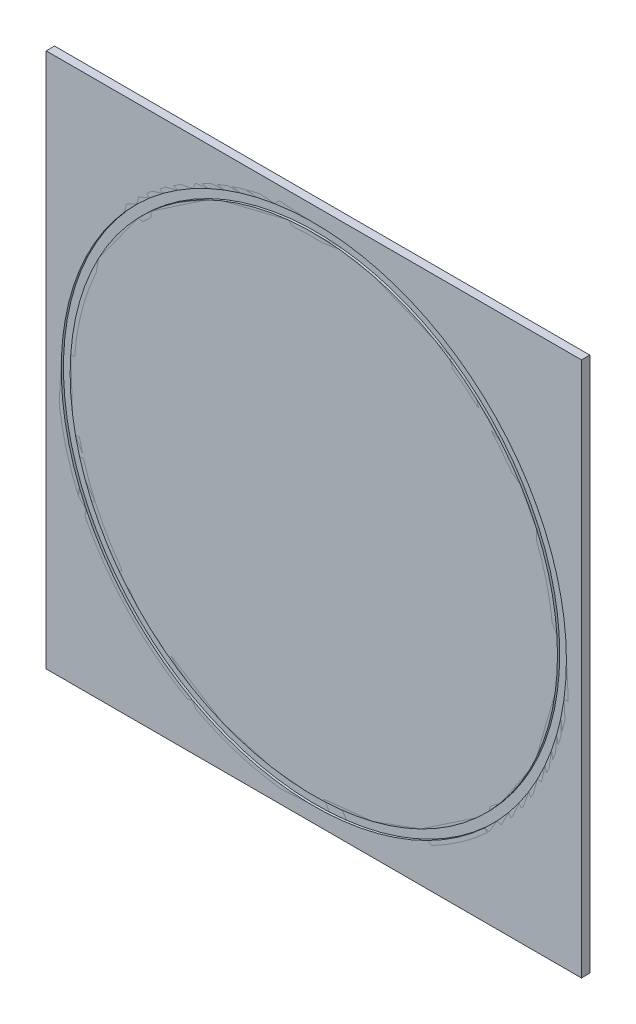
ISO-10303-21;
HEADER;
FILE_DESCRIPTION(('STEP AP214'),'2;1');
FILE_NAME('part.step','',(''),(''),'','','');
FILE_SCHEMA(('AUTOMOTIVE_DESIGN { 1 0 10303 214 1 1 1 1 }'));
ENDSEC;
DATA;
#1=APPLICATION_CONTEXT('core data for automotive mechanical design processes');
#2=APPLICATION_PROTOCOL_DEFINITION('international standard','automotive_design',2000,#1);
#3=PRODUCT_CONTEXT('',#1,'mechanical');
#4=PRODUCT('Part','Part','',(#3));
#5=PRODUCT_RELATED_PRODUCT_CATEGORY('part','',(#4));
#6=PRODUCT_DEFINITION_FORMATION('','',#4);
#7=PRODUCT_DEFINITION_CONTEXT('part definition',#1,'design');
#8=PRODUCT_DEFINITION('design','',#6,#7);
#9=PRODUCT_DEFINITION_SHAPE('','',#8);
#10=(LENGTH_UNIT() NAMED_UNIT(*) SI_UNIT(.MILLI.,.METRE.));
#11=(NAMED_UNIT(*) PLANE_ANGLE_UNIT() SI_UNIT($,.RADIAN.));
#12=(NAMED_UNIT(*) SI_UNIT($,.STERADIAN.) SOLID_ANGLE_UNIT());
#13=UNCERTAINTY_MEASURE_WITH_UNIT(LENGTH_MEASURE(1.E-05),#10,'distance_accuracy_value','');
#14=(GEOMETRIC_REPRESENTATION_CONTEXT(3) GLOBAL_UNCERTAINTY_ASSIGNED_CONTEXT((#13)) GLOBAL_UNIT_ASSIGNED_CONTEXT((#10,
#11,#12)) REPRESENTATION_CONTEXT('',''));
#15=CARTESIAN_POINT('',(0.,0.,0.));
#16=DIRECTION('',(0.,0.,1.));
#17=DIRECTION('',(1.,0.,0.));
#18=AXIS2_PLACEMENT_3D('',#15,#16,#17);
#19=CARTESIAN_POINT('',(-609.6,609.6,0.));
#20=DIRECTION('',(-1.,0.,0.));
#21=DIRECTION('',(0.,-1.,0.));
#22=AXIS2_PLACEMENT_3D('',#19,#20,#21);
#23=PLANE('',#22);
#24=DIRECTION('',(0.,-1.,0.));
#25=VECTOR('',#24,1.);
#26=CARTESIAN_POINT('',(-609.6,609.6,19.05));
#27=LINE('',#26,#25);
#28=CARTESIAN_POINT('',(-609.6,609.6,19.05));
#29=VERTEX_POINT('',#28);
#30=CARTESIAN_POINT('',(-609.6,-609.6,19.05));
#31=VERTEX_POINT('',#30);
#32=EDGE_CURVE('E113',#29,#31,#27,.T.);
#33=ORIENTED_EDGE('',*,*,#32,.F.);
#34=DIRECTION('',(0.,0.,1.));
#35=VECTOR('',#34,1.);
#36=CARTESIAN_POINT('',(-609.6,609.6,0.));
#37=LINE('',#36,#35);
#38=CARTESIAN_POINT('',(-609.6,609.6,0.));
#39=VERTEX_POINT('',#38);
#40=EDGE_CURVE('E12',#39,#29,#37,.T.);
#41=ORIENTED_EDGE('',*,*,#40,.F.);
#42=DIRECTION('',(0.,-1.,0.));
#43=VECTOR('',#42,1.);
#44=CARTESIAN_POINT('',(-609.6,609.6,0.));
#45=LINE('',#44,#43);
#46=CARTESIAN_POINT('',(-609.6,-609.6,0.));
#47=VERTEX_POINT('',#46);
#48=EDGE_CURVE('E106',#39,#47,#45,.T.);
#49=ORIENTED_EDGE('',*,*,#48,.T.);
#50=DIRECTION('',(0.,0.,1.));
#51=VECTOR('',#50,1.);
#52=CARTESIAN_POINT('',(-609.6,-609.6,0.));
#53=LINE('',#52,#51);
#54=EDGE_CURVE('E51',#47,#31,#53,.T.);
#55=ORIENTED_EDGE('',*,*,#54,.T.);
#56=EDGE_LOOP('',(#33,#41,#49,#55));
#57=FACE_BOUND('',#56,.T.);
#58=ADVANCED_FACE('F48',(#57),#23,.T.);
#59=CARTESIAN_POINT('',(609.6,609.6,0.));
#60=DIRECTION('',(0.,1.,0.));
#61=DIRECTION('',(-1.,0.,0.));
#62=AXIS2_PLACEMENT_3D('',#59,#60,#61);
#63=PLANE('',#62);
#64=DIRECTION('',(-1.,0.,0.));
#65=VECTOR('',#64,1.);
#66=CARTESIAN_POINT('',(609.6,609.6,19.05));
#67=LINE('',#66,#65);
#68=CARTESIAN_POINT('',(609.6,609.6,19.05));
#69=VERTEX_POINT('',#68);
#70=EDGE_CURVE('E108',#69,#29,#67,.T.);
#71=ORIENTED_EDGE('',*,*,#70,.F.);
#72=DIRECTION('',(0.,0.,1.));
#73=VECTOR('',#72,1.);
#74=CARTESIAN_POINT('',(609.6,609.6,0.));
#75=LINE('',#74,#73);
#76=CARTESIAN_POINT('',(609.6,609.6,0.));
#77=VERTEX_POINT('',#76);
#78=EDGE_CURVE('E57',#77,#69,#75,.T.);
#79=ORIENTED_EDGE('',*,*,#78,.F.);
#80=DIRECTION('',(-1.,0.,0.));
#81=VECTOR('',#80,1.);
#82=CARTESIAN_POINT('',(609.6,609.6,0.));
#83=LINE('',#82,#81);
#84=EDGE_CURVE('E103',#77,#39,#83,.T.);
#85=ORIENTED_EDGE('',*,*,#84,.T.);
#86=ORIENTED_EDGE('',*,*,#40,.T.);
#87=EDGE_LOOP('',(#71,#79,#85,#86));
#88=FACE_BOUND('',#87,.T.);
#89=ADVANCED_FACE('F124',(#88),#63,.T.);
#90=CARTESIAN_POINT('',(609.6,609.6,0.));
#91=DIRECTION('',(1.,0.,0.));
#92=DIRECTION('',(0.,1.,0.));
#93=AXIS2_PLACEMENT_3D('',#90,#91,#92);
#94=PLANE('',#93);
#95=DIRECTION('',(0.,1.,0.));
#96=VECTOR('',#95,1.);
#97=CARTESIAN_POINT('',(609.6,609.6,19.05));
#98=LINE('',#97,#96);
#99=CARTESIAN_POINT('',(609.6,-609.6,19.05));
#100=VERTEX_POINT('',#99);
#101=EDGE_CURVE('E98',#100,#69,#98,.T.);
#102=ORIENTED_EDGE('',*,*,#101,.F.);
#103=DIRECTION('',(0.,0.,1.));
#104=VECTOR('',#103,1.);
#105=CARTESIAN_POINT('',(609.6,-609.6,0.));
#106=LINE('',#105,#104);
#107=CARTESIAN_POINT('',(609.6,-609.6,0.));
#108=VERTEX_POINT('',#107);
#109=EDGE_CURVE('E93',#108,#100,#106,.T.);
#110=ORIENTED_EDGE('',*,*,#109,.F.);
#111=DIRECTION('',(0.,1.,0.));
#112=VECTOR('',#111,1.);
#113=CARTESIAN_POINT('',(609.6,609.6,0.));
#114=LINE('',#113,#112);
#115=EDGE_CURVE('E96',#108,#77,#114,.T.);
#116=ORIENTED_EDGE('',*,*,#115,.T.);
#117=ORIENTED_EDGE('',*,*,#78,.T.);
#118=EDGE_LOOP('',(#102,#110,#116,#117));
#119=FACE_BOUND('',#118,.T.);
#120=ADVANCED_FACE('F95',(#119),#94,.T.);
#121=CARTESIAN_POINT('',(609.6,-609.6,0.));
#122=DIRECTION('',(0.,-1.,0.));
#123=DIRECTION('',(0.,0.,-1.));
#124=AXIS2_PLACEMENT_3D('',#121,#122,#123);
#125=PLANE('',#124);
#126=DIRECTION('',(1.,0.,0.));
#127=VECTOR('',#126,1.);
#128=CARTESIAN_POINT('',(609.6,-609.6,19.05));
#129=LINE('',#128,#127);
#130=EDGE_CURVE('E116',#31,#100,#129,.T.);
#131=ORIENTED_EDGE('',*,*,#130,.F.);
#132=ORIENTED_EDGE('',*,*,#54,.F.);
#133=DIRECTION('',(1.,0.,0.));
#134=VECTOR('',#133,1.);
#135=CARTESIAN_POINT('',(609.6,-609.6,0.));
#136=LINE('',#135,#134);
#137=EDGE_CURVE('E102',#47,#108,#136,.T.);
#138=ORIENTED_EDGE('',*,*,#137,.T.);
#139=ORIENTED_EDGE('',*,*,#109,.T.);
#140=EDGE_LOOP('',(#131,#132,#138,#139));
#141=FACE_BOUND('',#140,.T.);
#142=ADVANCED_FACE('F105',(#141),#125,.T.);
#143=CARTESIAN_POINT('',(0.,0.,0.));
#144=DIRECTION('',(0.,0.,-1.));
#145=DIRECTION('',(-1.,0.,0.));
#146=AXIS2_PLACEMENT_3D('',#143,#144,#145);
#147=PLANE('',#146);
#148=ORIENTED_EDGE('',*,*,#48,.F.);
#149=ORIENTED_EDGE('',*,*,#84,.F.);
#150=ORIENTED_EDGE('',*,*,#115,.F.);
#151=ORIENTED_EDGE('',*,*,#137,.F.);
#152=EDGE_LOOP('',(#148,#149,#150,#151));
#153=FACE_BOUND('',#152,.T.);
#154=ADVANCED_FACE('F101',(#153),#147,.T.);
#155=CARTESIAN_POINT('',(0.,0.,19.05));
#156=DIRECTION('',(0.,0.,-1.));
#157=DIRECTION('',(-1.,0.,0.));
#158=AXIS2_PLACEMENT_3D('',#155,#156,#157);
#159=PLANE('',#158);
#160=CARTESIAN_POINT('',(0.,0.,19.05));
#161=DIRECTION('',(0.,0.,1.));
#162=DIRECTION('',(1.,0.,0.));
#163=AXIS2_PLACEMENT_3D('',#160,#161,#162);
#164=CIRCLE('',#163,575.31);
#165=CARTESIAN_POINT('',(575.31,0.,19.05));
#166=VERTEX_POINT('',#165);
#167=EDGE_CURVE('E168',#166,#166,#164,.T.);
#168=ORIENTED_EDGE('',*,*,#167,.F.);
#169=EDGE_LOOP('',(#168));
#170=FACE_BOUND('',#169,.T.);
#171=ORIENTED_EDGE('',*,*,#32,.T.);
#172=ORIENTED_EDGE('',*,*,#130,.T.);
#173=ORIENTED_EDGE('',*,*,#101,.T.);
#174=ORIENTED_EDGE('',*,*,#70,.T.);
#175=EDGE_LOOP('',(#171,#172,#173,#174));
#176=FACE_BOUND('',#175,.T.);
#177=ADVANCED_FACE('F123',(#170,#176),#159,.F.);
#178=CARTESIAN_POINT('',(0.,0.,13.97));
#179=DIRECTION('',(0.,0.,1.));
#180=DIRECTION('',(1.,0.,0.));
#181=AXIS2_PLACEMENT_3D('',#178,#179,#180);
#182=CYLINDRICAL_SURFACE('',#181,575.31);
#183=CARTESIAN_POINT('',(0.,0.,13.97));
#184=DIRECTION('',(0.,0.,1.));
#185=DIRECTION('',(1.,0.,0.));
#186=AXIS2_PLACEMENT_3D('',#183,#184,#185);
#187=CIRCLE('',#186,575.31);
#188=CARTESIAN_POINT('',(575.31,0.,13.97));
#189=VERTEX_POINT('',#188);
#190=EDGE_CURVE('E117',#189,#189,#187,.T.);
#191=ORIENTED_EDGE('',*,*,#190,.F.);
#192=EDGE_LOOP('',(#191));
#193=FACE_BOUND('',#192,.T.);
#194=ORIENTED_EDGE('',*,*,#167,.T.);
#195=EDGE_LOOP('',(#194));
#196=FACE_BOUND('',#195,.T.);
#197=ADVANCED_FACE('F142',(#193,#196),#182,.F.);
#198=CARTESIAN_POINT('',(0.,0.,13.97));
#199=DIRECTION('',(0.,0.,1.));
#200=DIRECTION('',(1.,0.,0.));
#201=AXIS2_PLACEMENT_3D('',#198,#199,#200);
#202=PLANE('',#201);
#203=CARTESIAN_POINT('',(0.,0.,13.97));
#204=DIRECTION('',(0.,0.,1.));
#205=DIRECTION('',(1.,0.,0.));
#206=AXIS2_PLACEMENT_3D('',#203,#204,#205);
#207=CIRCLE('',#206,554.99);
#208=CARTESIAN_POINT('',(554.99,0.,13.97));
#209=VERTEX_POINT('',#208);
#210=EDGE_CURVE('E163',#209,#209,#207,.T.);
#211=ORIENTED_EDGE('',*,*,#210,.F.);
#212=EDGE_LOOP('',(#211));
#213=FACE_BOUND('',#212,.T.);
#214=ORIENTED_EDGE('',*,*,#190,.T.);
#215=EDGE_LOOP('',(#214));
#216=FACE_BOUND('',#215,.T.);
#217=ADVANCED_FACE('F148',(#213,#216),#202,.T.);
#218=CARTESIAN_POINT('',(0.,0.,13.97));
#219=DIRECTION('',(0.,0.,1.));
#220=DIRECTION('',(1.,0.,0.));
#221=AXIS2_PLACEMENT_3D('',#218,#219,#220);
#222=CYLINDRICAL_SURFACE('',#221,554.99);
#223=ORIENTED_EDGE('',*,*,#210,.T.);
#224=EDGE_LOOP('',(#223));
#225=FACE_BOUND('',#224,.T.);
#226=CARTESIAN_POINT('',(0.,0.,19.05));
#227=DIRECTION('',(0.,0.,1.));
#228=DIRECTION('',(1.,0.,0.));
#229=AXIS2_PLACEMENT_3D('',#226,#227,#228);
#230=CIRCLE('',#229,554.99);
#231=CARTESIAN_POINT('',(554.99,0.,19.05));
#232=VERTEX_POINT('',#231);
#233=EDGE_CURVE('E166',#232,#232,#230,.T.);
#234=ORIENTED_EDGE('',*,*,#233,.F.);
#235=EDGE_LOOP('',(#234));
#236=FACE_BOUND('',#235,.T.);
#237=ADVANCED_FACE('F152',(#225,#236),#222,.T.);
#238=ORIENTED_EDGE('',*,*,#233,.T.);
#239=EDGE_LOOP('',(#238));
#240=FACE_BOUND('',#239,.T.);
#241=ADVANCED_FACE('F144',(#240),#159,.F.);
#242=CLOSED_SHELL('',(#58,#89,#120,#142,#154,#177,#197,#217,#237,#241));
#243=MANIFOLD_SOLID_BREP('B2_NOT_SHOWN',#242);
#244=CARTESIAN_POINT('',(0.,0.,19.05));
#245=DIRECTION('',(0.,0.,1.));
#246=DIRECTION('',(1.,0.,0.));
#247=AXIS2_PLACEMENT_3D('',#244,#245,#246);
#248=PLANE('',#247);
#249=CARTESIAN_POINT('',(0.,0.,19.05));
#250=DIRECTION('',(0.,0.,1.));
#251=DIRECTION('',(1.,0.,0.));
#252=AXIS2_PLACEMENT_3D('',#249,#250,#251);
#253=CIRCLE('',#252,546.1);
#254=CARTESIAN_POINT('',(-546.1,0.,19.05));
#255=VERTEX_POINT('',#254);
#256=EDGE_CURVE('E243',#255,#255,#253,.T.);
#257=ORIENTED_EDGE('',*,*,#256,.F.);
#258=EDGE_LOOP('',(#257));
#259=FACE_BOUND('',#258,.T.);
#260=CARTESIAN_POINT('',(0.,0.,19.05));
#261=DIRECTION('',(0.,0.,1.));
#262=DIRECTION('',(1.,0.,0.));
#263=AXIS2_PLACEMENT_3D('',#260,#261,#262);
#264=CIRCLE('',#263,554.99);
#265=CARTESIAN_POINT('',(554.99,0.,19.05));
#266=VERTEX_POINT('',#265);
#267=EDGE_CURVE('E261',#266,#266,#264,.T.);
#268=ORIENTED_EDGE('',*,*,#267,.T.);
#269=EDGE_LOOP('',(#268));
#270=FACE_BOUND('',#269,.T.);
#271=ADVANCED_FACE('F230',(#259,#270),#248,.T.);
#272=CARTESIAN_POINT('',(0.,0.,19.05));
#273=DIRECTION('',(0.,0.,1.));
#274=DIRECTION('',(1.,0.,0.));
#275=AXIS2_PLACEMENT_3D('',#272,#273,#274);
#276=CIRCLE('',#275,575.31);
#277=CARTESIAN_POINT('',(575.31,0.,19.05));
#278=VERTEX_POINT('',#277);
#279=EDGE_CURVE('E253',#278,#278,#276,.T.);
#280=ORIENTED_EDGE('',*,*,#279,.F.);
#281=EDGE_LOOP('',(#280));
#282=FACE_BOUND('',#281,.T.);
#283=CARTESIAN_POINT('',(0.,0.,19.05));
#284=DIRECTION('',(0.,0.,1.));
#285=DIRECTION('',(1.,0.,0.));
#286=AXIS2_PLACEMENT_3D('',#283,#284,#285);
#287=CIRCLE('',#286,584.2);
#288=CARTESIAN_POINT('',(-584.2,0.,19.05));
#289=VERTEX_POINT('',#288);
#290=EDGE_CURVE('E47',#289,#289,#287,.T.);
#291=ORIENTED_EDGE('',*,*,#290,.T.);
#292=EDGE_LOOP('',(#291));
#293=FACE_BOUND('',#292,.T.);
#294=ADVANCED_FACE('F285',(#282,#293),#248,.T.);
#295=CARTESIAN_POINT('',(0.,0.,0.));
#296=DIRECTION('',(0.,0.,1.));
#297=DIRECTION('',(1.,0.,0.));
#298=AXIS2_PLACEMENT_3D('',#295,#296,#297);
#299=PLANE('',#298);
#300=CARTESIAN_POINT('',(0.,0.,0.));
#301=DIRECTION('',(0.,0.,1.));
#302=DIRECTION('',(1.,0.,0.));
#303=AXIS2_PLACEMENT_3D('',#300,#301,#302);
#304=CIRCLE('',#303,584.2);
#305=CARTESIAN_POINT('',(-584.2,0.,0.));
#306=VERTEX_POINT('',#305);
#307=EDGE_CURVE('E234',#306,#306,#304,.T.);
#308=ORIENTED_EDGE('',*,*,#307,.F.);
#309=EDGE_LOOP('',(#308));
#310=FACE_BOUND('',#309,.T.);
#311=CARTESIAN_POINT('',(0.,0.,0.));
#312=DIRECTION('',(0.,0.,1.));
#313=DIRECTION('',(1.,0.,0.));
#314=AXIS2_PLACEMENT_3D('',#311,#312,#313);
#315=CIRCLE('',#314,546.1);
#316=CARTESIAN_POINT('',(-546.1,0.,0.));
#317=VERTEX_POINT('',#316);
#318=EDGE_CURVE('E245',#317,#317,#315,.T.);
#319=ORIENTED_EDGE('',*,*,#318,.T.);
#320=EDGE_LOOP('',(#319));
#321=FACE_BOUND('',#320,.T.);
#322=ADVANCED_FACE('F287',(#310,#321),#299,.F.);
#323=CARTESIAN_POINT('',(0.,0.,19.05));
#324=DIRECTION('',(0.,0.,-1.));
#325=DIRECTION('',(-1.,0.,0.));
#326=AXIS2_PLACEMENT_3D('',#323,#324,#325);
#327=CYLINDRICAL_SURFACE('',#326,584.2);
#328=CARTESIAN_POINT('',(-584.2,0.,19.05));
#329=CARTESIAN_POINT('',(-584.2,0.,18.8515625));
#330=CARTESIAN_POINT('',(-584.2,0.,18.653125));
#331=CARTESIAN_POINT('',(-584.2,0.,18.25625));
#332=CARTESIAN_POINT('',(-584.2,0.,18.0578125));
#333=CARTESIAN_POINT('',(-584.2,0.,17.6609375));
#334=CARTESIAN_POINT('',(-584.2,0.,17.4625));
#335=CARTESIAN_POINT('',(-584.2,0.,17.065625));
#336=CARTESIAN_POINT('',(-584.2,0.,16.8671875));
#337=CARTESIAN_POINT('',(-584.2,0.,16.4703125));
#338=CARTESIAN_POINT('',(-584.2,0.,16.271875));
#339=CARTESIAN_POINT('',(-584.2,0.,15.875));
#340=CARTESIAN_POINT('',(-584.2,0.,15.6765625));
#341=CARTESIAN_POINT('',(-584.2,0.,15.2796875));
#342=CARTESIAN_POINT('',(-584.2,0.,15.08125));
#343=CARTESIAN_POINT('',(-584.2,0.,14.684375));
#344=CARTESIAN_POINT('',(-584.2,0.,14.4859375));
#345=CARTESIAN_POINT('',(-584.2,0.,14.0890625));
#346=CARTESIAN_POINT('',(-584.2,0.,13.890625));
#347=CARTESIAN_POINT('',(-584.2,0.,13.49375));
#348=CARTESIAN_POINT('',(-584.2,0.,13.2953125));
#349=CARTESIAN_POINT('',(-584.2,0.,12.8984375));
#350=CARTESIAN_POINT('',(-584.2,0.,12.7));
#351=CARTESIAN_POINT('',(-584.2,0.,12.303125));
#352=CARTESIAN_POINT('',(-584.2,0.,12.1046875));
#353=CARTESIAN_POINT('',(-584.2,0.,11.7078125));
#354=CARTESIAN_POINT('',(-584.2,0.,11.509375));
#355=CARTESIAN_POINT('',(-584.2,0.,11.1125));
#356=CARTESIAN_POINT('',(-584.2,0.,10.9140625));
#357=CARTESIAN_POINT('',(-584.2,0.,10.5171875));
#358=CARTESIAN_POINT('',(-584.2,0.,10.31875));
#359=CARTESIAN_POINT('',(-584.2,0.,9.921875));
#360=CARTESIAN_POINT('',(-584.2,0.,9.7234375));
#361=CARTESIAN_POINT('',(-584.2,0.,9.3265625));
#362=CARTESIAN_POINT('',(-584.2,0.,9.128125));
#363=CARTESIAN_POINT('',(-584.2,0.,8.73125));
#364=CARTESIAN_POINT('',(-584.2,0.,8.5328125));
#365=CARTESIAN_POINT('',(-584.2,0.,8.1359375));
#366=CARTESIAN_POINT('',(-584.2,0.,7.9375));
#367=CARTESIAN_POINT('',(-584.2,0.,7.540625));
#368=CARTESIAN_POINT('',(-584.2,0.,7.3421875));
#369=CARTESIAN_POINT('',(-584.2,0.,6.9453125));
#370=CARTESIAN_POINT('',(-584.2,0.,6.746875));
#371=CARTESIAN_POINT('',(-584.2,0.,6.35));
#372=CARTESIAN_POINT('',(-584.2,0.,6.1515625));
#373=CARTESIAN_POINT('',(-584.2,0.,5.7546875));
#374=CARTESIAN_POINT('',(-584.2,0.,5.55625));
#375=CARTESIAN_POINT('',(-584.2,0.,5.159375));
#376=CARTESIAN_POINT('',(-584.2,0.,4.9609375));
#377=CARTESIAN_POINT('',(-584.2,0.,4.5640625));
#378=CARTESIAN_POINT('',(-584.2,0.,4.365625));
#379=CARTESIAN_POINT('',(-584.2,0.,3.96875));
#380=CARTESIAN_POINT('',(-584.2,0.,3.7703125));
#381=CARTESIAN_POINT('',(-584.2,0.,3.3734375));
#382=CARTESIAN_POINT('',(-584.2,0.,3.175));
#383=CARTESIAN_POINT('',(-584.2,0.,2.778125));
#384=CARTESIAN_POINT('',(-584.2,0.,2.5796875));
#385=CARTESIAN_POINT('',(-584.2,0.,2.1828125));
#386=CARTESIAN_POINT('',(-584.2,0.,1.984375));
#387=CARTESIAN_POINT('',(-584.2,0.,1.5875));
#388=CARTESIAN_POINT('',(-584.2,0.,1.3890625));
#389=CARTESIAN_POINT('',(-584.2,0.,0.992187500000001));
#390=CARTESIAN_POINT('',(-584.2,0.,0.793750000000001));
#391=CARTESIAN_POINT('',(-584.2,0.,0.396875));
#392=CARTESIAN_POINT('',(-584.2,0.,0.1984375));
#393=CARTESIAN_POINT('',(-584.2,0.,0.));
#394=B_SPLINE_CURVE_WITH_KNOTS('',3,(#328,#329,#330,#331,#332,#333,#334,#335,#336,#337,#338,
#339,#340,#341,#342,#343,#344,#345,#346,#347,#348,#349,#350,#351,#352,#353,#354,#355,#356,#357,
#358,#359,#360,#361,#362,#363,#364,#365,#366,#367,#368,#369,#370,#371,#372,#373,#374,#375,#376,
#377,#378,#379,#380,#381,#382,#383,#384,#385,#386,#387,#388,#389,#390,#391,#392,#393),
.UNSPECIFIED.,.F.,.F.,(4,2,2,2,2,2,2,2,2,2,2,2,2,2,2,2,2,2,2,2,2,2,2,2,2,2,2,2,2,2,2,2,4),(0.,
0.595312499999997,1.190625,1.7859375,2.38125,2.9765625,3.571875,4.1671875,4.7625,5.3578125,
5.953125,6.5484375,7.14375,7.7390625,8.334375,8.9296875,9.525,10.1203125,10.715625,11.3109375,
11.90625,12.5015625,13.096875,13.6921875,14.2875,14.8828125,15.478125,16.0734375,16.66875,
17.2640625,17.859375,18.4546875,19.05),.UNSPECIFIED.);
#395=EDGE_CURVE('BSEAM232',#289,#306,#394,.T.);
#396=ORIENTED_EDGE('',*,*,#290,.F.);
#397=ORIENTED_EDGE('',*,*,#307,.T.);
#398=ORIENTED_EDGE('',*,*,#395,.T.);
#399=ORIENTED_EDGE('',*,*,#395,.F.);
#400=EDGE_LOOP('',(#396,#398,#397,#399));
#401=FACE_BOUND('',#400,.T.);
#402=ADVANCED_FACE('F232',(#401),#327,.T.);
#403=CARTESIAN_POINT('',(0.,0.,19.05));
#404=DIRECTION('',(0.,0.,-1.));
#405=DIRECTION('',(-1.,0.,0.));
#406=AXIS2_PLACEMENT_3D('',#403,#404,#405);
#407=CYLINDRICAL_SURFACE('',#406,546.1);
#408=CARTESIAN_POINT('',(-546.1,0.,19.05));
#409=CARTESIAN_POINT('',(-546.1,0.,18.8515625));
#410=CARTESIAN_POINT('',(-546.1,0.,18.653125));
#411=CARTESIAN_POINT('',(-546.1,0.,18.25625));
#412=CARTESIAN_POINT('',(-546.1,0.,18.0578125));
#413=CARTESIAN_POINT('',(-546.1,0.,17.6609375));
#414=CARTESIAN_POINT('',(-546.1,0.,17.4625));
#415=CARTESIAN_POINT('',(-546.1,0.,17.065625));
#416=CARTESIAN_POINT('',(-546.1,0.,16.8671875));
#417=CARTESIAN_POINT('',(-546.1,0.,16.4703125));
#418=CARTESIAN_POINT('',(-546.1,0.,16.271875));
#419=CARTESIAN_POINT('',(-546.1,0.,15.875));
#420=CARTESIAN_POINT('',(-546.1,0.,15.6765625));
#421=CARTESIAN_POINT('',(-546.1,0.,15.2796875));
#422=CARTESIAN_POINT('',(-546.1,0.,15.08125));
#423=CARTESIAN_POINT('',(-546.1,0.,14.684375));
#424=CARTESIAN_POINT('',(-546.1,0.,14.4859375));
#425=CARTESIAN_POINT('',(-546.1,0.,14.0890625));
#426=CARTESIAN_POINT('',(-546.1,0.,13.890625));
#427=CARTESIAN_POINT('',(-546.1,0.,13.49375));
#428=CARTESIAN_POINT('',(-546.1,0.,13.2953125));
#429=CARTESIAN_POINT('',(-546.1,0.,12.8984375));
#430=CARTESIAN_POINT('',(-546.1,0.,12.7));
#431=CARTESIAN_POINT('',(-546.1,0.,12.303125));
#432=CARTESIAN_POINT('',(-546.1,0.,12.1046875));
#433=CARTESIAN_POINT('',(-546.1,0.,11.7078125));
#434=CARTESIAN_POINT('',(-546.1,0.,11.509375));
#435=CARTESIAN_POINT('',(-546.1,0.,11.1125));
#436=CARTESIAN_POINT('',(-546.1,0.,10.9140625));
#437=CARTESIAN_POINT('',(-546.1,0.,10.5171875));
#438=CARTESIAN_POINT('',(-546.1,0.,10.31875));
#439=CARTESIAN_POINT('',(-546.1,0.,9.921875));
#440=CARTESIAN_POINT('',(-546.1,0.,9.7234375));
#441=CARTESIAN_POINT('',(-546.1,0.,9.3265625));
#442=CARTESIAN_POINT('',(-546.1,0.,9.128125));
#443=CARTESIAN_POINT('',(-546.1,0.,8.73125));
#444=CARTESIAN_POINT('',(-546.1,0.,8.5328125));
#445=CARTESIAN_POINT('',(-546.1,0.,8.1359375));
#446=CARTESIAN_POINT('',(-546.1,0.,7.9375));
#447=CARTESIAN_POINT('',(-546.1,0.,7.540625));
#448=CARTESIAN_POINT('',(-546.1,0.,7.3421875));
#449=CARTESIAN_POINT('',(-546.1,0.,6.9453125));
#450=CARTESIAN_POINT('',(-546.1,0.,6.746875));
#451=CARTESIAN_POINT('',(-546.1,0.,6.35));
#452=CARTESIAN_POINT('',(-546.1,0.,6.1515625));
#453=CARTESIAN_POINT('',(-546.1,0.,5.7546875));
#454=CARTESIAN_POINT('',(-546.1,0.,5.55625));
#455=CARTESIAN_POINT('',(-546.1,0.,5.159375));
#456=CARTESIAN_POINT('',(-546.1,0.,4.9609375));
#457=CARTESIAN_POINT('',(-546.1,0.,4.5640625));
#458=CARTESIAN_POINT('',(-546.1,0.,4.365625));
#459=CARTESIAN_POINT('',(-546.1,0.,3.96875));
#460=CARTESIAN_POINT('',(-546.1,0.,3.7703125));
#461=CARTESIAN_POINT('',(-546.1,0.,3.3734375));
#462=CARTESIAN_POINT('',(-546.1,0.,3.175));
#463=CARTESIAN_POINT('',(-546.1,0.,2.778125));
#464=CARTESIAN_POINT('',(-546.1,0.,2.5796875));
#465=CARTESIAN_POINT('',(-546.1,0.,2.1828125));
#466=CARTESIAN_POINT('',(-546.1,0.,1.984375));
#467=CARTESIAN_POINT('',(-546.1,0.,1.5875));
#468=CARTESIAN_POINT('',(-546.1,0.,1.3890625));
#469=CARTESIAN_POINT('',(-546.1,0.,0.992187500000001));
#470=CARTESIAN_POINT('',(-546.1,0.,0.793750000000001));
#471=CARTESIAN_POINT('',(-546.1,0.,0.396875));
#472=CARTESIAN_POINT('',(-546.1,0.,0.1984375));
#473=CARTESIAN_POINT('',(-546.1,0.,0.));
#474=B_SPLINE_CURVE_WITH_KNOTS('',3,(#408,#409,#410,#411,#412,#413,#414,#415,#416,#417,#418,
#419,#420,#421,#422,#423,#424,#425,#426,#427,#428,#429,#430,#431,#432,#433,#434,#435,#436,#437,
#438,#439,#440,#441,#442,#443,#444,#445,#446,#447,#448,#449,#450,#451,#452,#453,#454,#455,#456,
#457,#458,#459,#460,#461,#462,#463,#464,#465,#466,#467,#468,#469,#470,#471,#472,#473),
.UNSPECIFIED.,.F.,.F.,(4,2,2,2,2,2,2,2,2,2,2,2,2,2,2,2,2,2,2,2,2,2,2,2,2,2,2,2,2,2,2,2,4),(0.,
0.595312499999997,1.190625,1.7859375,2.38125,2.9765625,3.571875,4.1671875,4.7625,5.3578125,
5.953125,6.5484375,7.14375,7.7390625,8.334375,8.9296875,9.525,10.1203125,10.715625,11.3109375,
11.90625,12.5015625,13.096875,13.6921875,14.2875,14.8828125,15.478125,16.0734375,16.66875,
17.2640625,17.859375,18.4546875,19.05),.UNSPECIFIED.);
#475=EDGE_CURVE('BSEAM281',#255,#317,#474,.T.);
#476=ORIENTED_EDGE('',*,*,#256,.T.);
#477=ORIENTED_EDGE('',*,*,#318,.F.);
#478=ORIENTED_EDGE('',*,*,#475,.T.);
#479=ORIENTED_EDGE('',*,*,#475,.F.);
#480=EDGE_LOOP('',(#476,#478,#477,#479));
#481=FACE_BOUND('',#480,.T.);
#482=ADVANCED_FACE('F281',(#481),#407,.F.);
#483=CARTESIAN_POINT('',(0.,0.,13.97));
#484=DIRECTION('',(0.,0.,1.));
#485=DIRECTION('',(1.,0.,0.));
#486=AXIS2_PLACEMENT_3D('',#483,#484,#485);
#487=CYLINDRICAL_SURFACE('',#486,575.31);
#488=CARTESIAN_POINT('',(0.,0.,13.97));
#489=DIRECTION('',(0.,0.,1.));
#490=DIRECTION('',(1.,0.,0.));
#491=AXIS2_PLACEMENT_3D('',#488,#489,#490);
#492=CIRCLE('',#491,575.31);
#493=CARTESIAN_POINT('',(575.31,0.,13.97));
#494=VERTEX_POINT('',#493);
#495=EDGE_CURVE('E249',#494,#494,#492,.T.);
#496=ORIENTED_EDGE('',*,*,#495,.F.);
#497=EDGE_LOOP('',(#496));
#498=FACE_BOUND('',#497,.T.);
#499=ORIENTED_EDGE('',*,*,#279,.T.);
#500=EDGE_LOOP('',(#499));
#501=FACE_BOUND('',#500,.T.);
#502=ADVANCED_FACE('F275',(#498,#501),#487,.F.);
#503=CARTESIAN_POINT('',(0.,0.,13.97));
#504=DIRECTION('',(0.,0.,1.));
#505=DIRECTION('',(1.,0.,0.));
#506=AXIS2_PLACEMENT_3D('',#503,#504,#505);
#507=PLANE('',#506);
#508=CARTESIAN_POINT('',(0.,0.,13.97));
#509=DIRECTION('',(0.,0.,1.));
#510=DIRECTION('',(1.,0.,0.));
#511=AXIS2_PLACEMENT_3D('',#508,#509,#510);
#512=CIRCLE('',#511,554.99);
#513=CARTESIAN_POINT('',(554.99,0.,13.97));
#514=VERTEX_POINT('',#513);
#515=EDGE_CURVE('E257',#514,#514,#512,.T.);
#516=ORIENTED_EDGE('',*,*,#515,.F.);
#517=EDGE_LOOP('',(#516));
#518=FACE_BOUND('',#517,.T.);
#519=ORIENTED_EDGE('',*,*,#495,.T.);
#520=EDGE_LOOP('',(#519));
#521=FACE_BOUND('',#520,.T.);
#522=ADVANCED_FACE('F272',(#518,#521),#507,.T.);
#523=CARTESIAN_POINT('',(0.,0.,13.97));
#524=DIRECTION('',(0.,0.,1.));
#525=DIRECTION('',(1.,0.,0.));
#526=AXIS2_PLACEMENT_3D('',#523,#524,#525);
#527=CYLINDRICAL_SURFACE('',#526,554.99);
#528=ORIENTED_EDGE('',*,*,#515,.T.);
#529=EDGE_LOOP('',(#528));
#530=FACE_BOUND('',#529,.T.);
#531=ORIENTED_EDGE('',*,*,#267,.F.);
#532=EDGE_LOOP('',(#531));
#533=FACE_BOUND('',#532,.T.);
#534=ADVANCED_FACE('F269',(#530,#533),#527,.T.);
#535=CLOSED_SHELL('',(#271,#294,#322,#402,#482,#502,#522,#534));
#536=MANIFOLD_SOLID_BREP('B6',#535);
#537=ADVANCED_BREP_SHAPE_REPRESENTATION('',(#18,#243,#536),#14);
#538=SHAPE_DEFINITION_REPRESENTATION(#9,#537);
ENDSEC;
END-ISO-10303-21;
